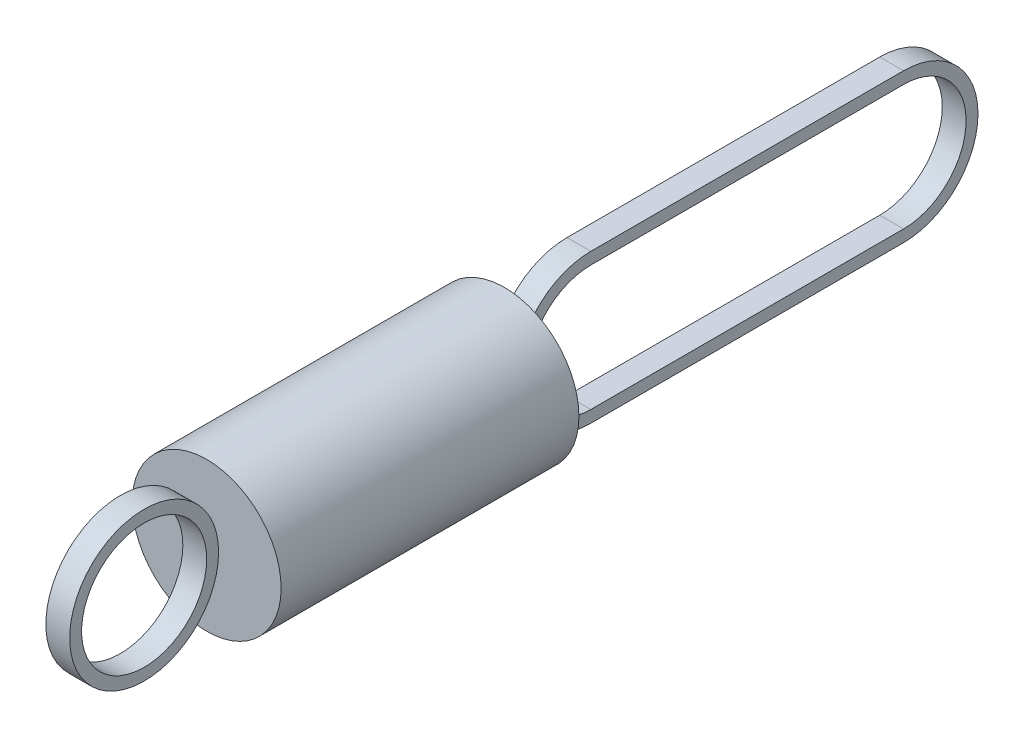
ISO-10303-21;
HEADER;
FILE_DESCRIPTION(('STEP AP214'),'2;1');
FILE_NAME('part.step','',(''),(''),'','','');
FILE_SCHEMA(('AUTOMOTIVE_DESIGN { 1 0 10303 214 1 1 1 1 }'));
ENDSEC;
DATA;
#1=APPLICATION_CONTEXT('core data for automotive mechanical design processes');
#2=APPLICATION_PROTOCOL_DEFINITION('international standard','automotive_design',2000,#1);
#3=PRODUCT_CONTEXT('',#1,'mechanical');
#4=PRODUCT('Part','Part','',(#3));
#5=PRODUCT_RELATED_PRODUCT_CATEGORY('part','',(#4));
#6=PRODUCT_DEFINITION_FORMATION('','',#4);
#7=PRODUCT_DEFINITION_CONTEXT('part definition',#1,'design');
#8=PRODUCT_DEFINITION('design','',#6,#7);
#9=PRODUCT_DEFINITION_SHAPE('','',#8);
#10=(LENGTH_UNIT() NAMED_UNIT(*) SI_UNIT(.MILLI.,.METRE.));
#11=(NAMED_UNIT(*) PLANE_ANGLE_UNIT() SI_UNIT($,.RADIAN.));
#12=(NAMED_UNIT(*) SI_UNIT($,.STERADIAN.) SOLID_ANGLE_UNIT());
#13=UNCERTAINTY_MEASURE_WITH_UNIT(LENGTH_MEASURE(1.E-05),#10,'distance_accuracy_value','');
#14=(GEOMETRIC_REPRESENTATION_CONTEXT(3) GLOBAL_UNCERTAINTY_ASSIGNED_CONTEXT((#13)) GLOBAL_UNIT_ASSIGNED_CONTEXT((#10,
#11,#12)) REPRESENTATION_CONTEXT('',''));
#15=CARTESIAN_POINT('',(0.,0.,0.));
#16=DIRECTION('',(0.,0.,1.));
#17=DIRECTION('',(1.,0.,0.));
#18=AXIS2_PLACEMENT_3D('',#15,#16,#17);
#19=CARTESIAN_POINT('',(0.,0.,-25.));
#20=DIRECTION('',(0.,0.,1.));
#21=DIRECTION('',(1.,0.,0.));
#22=AXIS2_PLACEMENT_3D('',#19,#20,#21);
#23=CYLINDRICAL_SURFACE('',#22,5.);
#24=CARTESIAN_POINT('',(0.,0.,-25.));
#25=DIRECTION('',(0.,0.,1.));
#26=DIRECTION('',(1.,0.,0.));
#27=AXIS2_PLACEMENT_3D('',#24,#25,#26);
#28=CIRCLE('',#27,5.);
#29=CARTESIAN_POINT('',(5.,0.,-25.));
#30=VERTEX_POINT('',#29);
#31=EDGE_CURVE('E11',#30,#30,#28,.T.);
#32=ORIENTED_EDGE('',*,*,#31,.T.);
#33=EDGE_LOOP('',(#32));
#34=FACE_BOUND('',#33,.T.);
#35=CARTESIAN_POINT('',(0.,0.,-5.));
#36=DIRECTION('',(0.,0.,1.));
#37=DIRECTION('',(1.,0.,0.));
#38=AXIS2_PLACEMENT_3D('',#35,#36,#37);
#39=CIRCLE('',#38,5.);
#40=CARTESIAN_POINT('',(5.,0.,-5.));
#41=VERTEX_POINT('',#40);
#42=EDGE_CURVE('E47',#41,#41,#39,.T.);
#43=ORIENTED_EDGE('',*,*,#42,.F.);
#44=EDGE_LOOP('',(#43));
#45=FACE_BOUND('',#44,.T.);
#46=ADVANCED_FACE('F44',(#34,#45),#23,.T.);
#47=CARTESIAN_POINT('',(0.,0.,-25.));
#48=DIRECTION('',(0.,0.,1.));
#49=DIRECTION('',(1.,0.,0.));
#50=AXIS2_PLACEMENT_3D('',#47,#48,#49);
#51=PLANE('',#50);
#52=ORIENTED_EDGE('',*,*,#31,.F.);
#53=EDGE_LOOP('',(#52));
#54=FACE_BOUND('',#53,.T.);
#55=ADVANCED_FACE('F59',(#54),#51,.F.);
#56=CARTESIAN_POINT('',(0.,0.,-5.));
#57=DIRECTION('',(0.,0.,1.));
#58=DIRECTION('',(1.,0.,0.));
#59=AXIS2_PLACEMENT_3D('',#56,#57,#58);
#60=PLANE('',#59);
#61=ORIENTED_EDGE('',*,*,#42,.T.);
#62=EDGE_LOOP('',(#61));
#63=FACE_BOUND('',#62,.T.);
#64=ADVANCED_FACE('F56',(#63),#60,.T.);
#65=CLOSED_SHELL('',(#46,#55,#64));
#66=MANIFOLD_SOLID_BREP('B2',#65);
#67=CARTESIAN_POINT('',(-0.8,0.,-51.));
#68=DIRECTION('',(1.,0.,0.));
#69=DIRECTION('',(0.,0.,-1.));
#70=AXIS2_PLACEMENT_3D('',#67,#68,#69);
#71=CYLINDRICAL_SURFACE('',#70,5.);
#72=DIRECTION('',(1.,0.,0.));
#73=VECTOR('',#72,1.);
#74=CARTESIAN_POINT('',(-0.8,5.,-51.));
#75=LINE('',#74,#73);
#76=CARTESIAN_POINT('',(-0.8,5.,-51.));
#77=VERTEX_POINT('',#76);
#78=CARTESIAN_POINT('',(0.8,5.,-51.));
#79=VERTEX_POINT('',#78);
#80=EDGE_CURVE('E95',#77,#79,#75,.T.);
#81=ORIENTED_EDGE('',*,*,#80,.T.);
#82=CARTESIAN_POINT('',(0.8,0.,-51.));
#83=DIRECTION('',(1.,0.,0.));
#84=DIRECTION('',(0.,0.,-1.));
#85=AXIS2_PLACEMENT_3D('',#82,#83,#84);
#86=CIRCLE('',#85,5.);
#87=CARTESIAN_POINT('',(0.8,-5.,-51.));
#88=VERTEX_POINT('',#87);
#89=EDGE_CURVE('E171',#88,#79,#86,.T.);
#90=ORIENTED_EDGE('',*,*,#89,.F.);
#91=DIRECTION('',(1.,0.,0.));
#92=VECTOR('',#91,1.);
#93=CARTESIAN_POINT('',(-0.8,-5.,-51.));
#94=LINE('',#93,#92);
#95=CARTESIAN_POINT('',(-0.8,-5.,-51.));
#96=VERTEX_POINT('',#95);
#97=EDGE_CURVE('E42',#96,#88,#94,.T.);
#98=ORIENTED_EDGE('',*,*,#97,.F.);
#99=CARTESIAN_POINT('',(-0.8,0.,-51.));
#100=DIRECTION('',(1.,0.,0.));
#101=DIRECTION('',(0.,0.,-1.));
#102=AXIS2_PLACEMENT_3D('',#99,#100,#101);
#103=CIRCLE('',#102,5.);
#104=EDGE_CURVE('E205',#96,#77,#103,.T.);
#105=ORIENTED_EDGE('',*,*,#104,.T.);
#106=EDGE_LOOP('',(#81,#90,#98,#105));
#107=FACE_BOUND('',#106,.T.);
#108=ADVANCED_FACE('F92',(#107),#71,.T.);
#109=CARTESIAN_POINT('',(-0.8,-5.,-51.));
#110=DIRECTION('',(0.,-1.,0.));
#111=DIRECTION('',(0.,0.,-1.));
#112=AXIS2_PLACEMENT_3D('',#109,#110,#111);
#113=PLANE('',#112);
#114=ORIENTED_EDGE('',*,*,#97,.T.);
#115=DIRECTION('',(0.,0.,-1.));
#116=VECTOR('',#115,1.);
#117=CARTESIAN_POINT('',(0.8,-5.,-51.));
#118=LINE('',#117,#116);
#119=CARTESIAN_POINT('',(0.8,-5.,-30.));
#120=VERTEX_POINT('',#119);
#121=EDGE_CURVE('E202',#120,#88,#118,.T.);
#122=ORIENTED_EDGE('',*,*,#121,.F.);
#123=DIRECTION('',(1.,0.,0.));
#124=VECTOR('',#123,1.);
#125=CARTESIAN_POINT('',(-0.8,-5.,-30.));
#126=LINE('',#125,#124);
#127=CARTESIAN_POINT('',(-0.8,-5.,-30.));
#128=VERTEX_POINT('',#127);
#129=EDGE_CURVE('E100',#128,#120,#126,.T.);
#130=ORIENTED_EDGE('',*,*,#129,.F.);
#131=DIRECTION('',(0.,0.,-1.));
#132=VECTOR('',#131,1.);
#133=CARTESIAN_POINT('',(-0.8,-5.,-51.));
#134=LINE('',#133,#132);
#135=EDGE_CURVE('E214',#128,#96,#134,.T.);
#136=ORIENTED_EDGE('',*,*,#135,.T.);
#137=EDGE_LOOP('',(#114,#122,#130,#136));
#138=FACE_BOUND('',#137,.T.);
#139=ADVANCED_FACE('F230',(#138),#113,.T.);
#140=CARTESIAN_POINT('',(-0.8,0.,-30.));
#141=DIRECTION('',(1.,0.,0.));
#142=DIRECTION('',(0.,0.,-1.));
#143=AXIS2_PLACEMENT_3D('',#140,#141,#142);
#144=CYLINDRICAL_SURFACE('',#143,5.);
#145=ORIENTED_EDGE('',*,*,#129,.T.);
#146=CARTESIAN_POINT('',(0.8,0.,-30.));
#147=DIRECTION('',(1.,0.,0.));
#148=DIRECTION('',(0.,0.,-1.));
#149=AXIS2_PLACEMENT_3D('',#146,#147,#148);
#150=CIRCLE('',#149,5.);
#151=CARTESIAN_POINT('',(0.8,5.,-30.));
#152=VERTEX_POINT('',#151);
#153=EDGE_CURVE('E199',#152,#120,#150,.T.);
#154=ORIENTED_EDGE('',*,*,#153,.F.);
#155=DIRECTION('',(1.,0.,0.));
#156=VECTOR('',#155,1.);
#157=CARTESIAN_POINT('',(-0.8,5.,-30.));
#158=LINE('',#157,#156);
#159=CARTESIAN_POINT('',(-0.8,5.,-30.));
#160=VERTEX_POINT('',#159);
#161=EDGE_CURVE('E217',#160,#152,#158,.T.);
#162=ORIENTED_EDGE('',*,*,#161,.F.);
#163=CARTESIAN_POINT('',(-0.8,0.,-30.));
#164=DIRECTION('',(1.,0.,0.));
#165=DIRECTION('',(0.,0.,-1.));
#166=AXIS2_PLACEMENT_3D('',#163,#164,#165);
#167=CIRCLE('',#166,5.);
#168=EDGE_CURVE('E211',#160,#128,#167,.T.);
#169=ORIENTED_EDGE('',*,*,#168,.T.);
#170=EDGE_LOOP('',(#145,#154,#162,#169));
#171=FACE_BOUND('',#170,.T.);
#172=ADVANCED_FACE('F234',(#171),#144,.T.);
#173=CARTESIAN_POINT('',(-0.8,5.,-51.));
#174=DIRECTION('',(0.,1.,0.));
#175=DIRECTION('',(0.,0.,1.));
#176=AXIS2_PLACEMENT_3D('',#173,#174,#175);
#177=PLANE('',#176);
#178=ORIENTED_EDGE('',*,*,#161,.T.);
#179=DIRECTION('',(0.,0.,1.));
#180=VECTOR('',#179,1.);
#181=CARTESIAN_POINT('',(0.8,5.,-51.));
#182=LINE('',#181,#180);
#183=EDGE_CURVE('E196',#79,#152,#182,.T.);
#184=ORIENTED_EDGE('',*,*,#183,.F.);
#185=ORIENTED_EDGE('',*,*,#80,.F.);
#186=DIRECTION('',(0.,0.,1.));
#187=VECTOR('',#186,1.);
#188=CARTESIAN_POINT('',(-0.8,5.,-51.));
#189=LINE('',#188,#187);
#190=EDGE_CURVE('E208',#77,#160,#189,.T.);
#191=ORIENTED_EDGE('',*,*,#190,.T.);
#192=EDGE_LOOP('',(#178,#184,#185,#191));
#193=FACE_BOUND('',#192,.T.);
#194=ADVANCED_FACE('F224',(#193),#177,.T.);
#195=CARTESIAN_POINT('',(-0.8,0.,-51.));
#196=DIRECTION('',(1.,0.,0.));
#197=DIRECTION('',(0.,0.,-1.));
#198=AXIS2_PLACEMENT_3D('',#195,#196,#197);
#199=PLANE('',#198);
#200=DIRECTION('',(0.,0.,1.));
#201=VECTOR('',#200,1.);
#202=CARTESIAN_POINT('',(-0.8,-4.2,-51.));
#203=LINE('',#202,#201);
#204=CARTESIAN_POINT('',(-0.8,-4.2,-51.));
#205=VERTEX_POINT('',#204);
#206=CARTESIAN_POINT('',(-0.8,-4.2,-30.));
#207=VERTEX_POINT('',#206);
#208=EDGE_CURVE('E177',#205,#207,#203,.T.);
#209=ORIENTED_EDGE('',*,*,#208,.F.);
#210=CARTESIAN_POINT('',(-0.8,0.,-51.));
#211=DIRECTION('',(1.,0.,0.));
#212=DIRECTION('',(0.,0.,-1.));
#213=AXIS2_PLACEMENT_3D('',#210,#211,#212);
#214=CIRCLE('',#213,4.2);
#215=CARTESIAN_POINT('',(-0.8,4.2,-51.));
#216=VERTEX_POINT('',#215);
#217=EDGE_CURVE('E159',#216,#205,#214,.F.);
#218=ORIENTED_EDGE('',*,*,#217,.F.);
#219=DIRECTION('',(0.,0.,-1.));
#220=VECTOR('',#219,1.);
#221=CARTESIAN_POINT('',(-0.8,4.2,-51.));
#222=LINE('',#221,#220);
#223=CARTESIAN_POINT('',(-0.8,4.2,-30.));
#224=VERTEX_POINT('',#223);
#225=EDGE_CURVE('E168',#224,#216,#222,.T.);
#226=ORIENTED_EDGE('',*,*,#225,.F.);
#227=CARTESIAN_POINT('',(-0.8,0.,-30.));
#228=DIRECTION('',(1.,0.,0.));
#229=DIRECTION('',(0.,0.,-1.));
#230=AXIS2_PLACEMENT_3D('',#227,#228,#229);
#231=CIRCLE('',#230,4.2);
#232=EDGE_CURVE('E108',#207,#224,#231,.F.);
#233=ORIENTED_EDGE('',*,*,#232,.F.);
#234=EDGE_LOOP('',(#209,#218,#226,#233));
#235=FACE_BOUND('',#234,.T.);
#236=ORIENTED_EDGE('',*,*,#104,.F.);
#237=ORIENTED_EDGE('',*,*,#135,.F.);
#238=ORIENTED_EDGE('',*,*,#168,.F.);
#239=ORIENTED_EDGE('',*,*,#190,.F.);
#240=EDGE_LOOP('',(#236,#237,#238,#239));
#241=FACE_BOUND('',#240,.T.);
#242=ADVANCED_FACE('F174',(#235,#241),#199,.F.);
#243=CARTESIAN_POINT('',(0.8,0.,-51.));
#244=DIRECTION('',(1.,0.,0.));
#245=DIRECTION('',(0.,0.,-1.));
#246=AXIS2_PLACEMENT_3D('',#243,#244,#245);
#247=PLANE('',#246);
#248=CARTESIAN_POINT('',(0.8,0.,-51.));
#249=DIRECTION('',(1.,0.,0.));
#250=DIRECTION('',(0.,0.,-1.));
#251=AXIS2_PLACEMENT_3D('',#248,#249,#250);
#252=CIRCLE('',#251,4.2);
#253=CARTESIAN_POINT('',(0.8,-4.2,-51.));
#254=VERTEX_POINT('',#253);
#255=CARTESIAN_POINT('',(0.8,4.2,-51.));
#256=VERTEX_POINT('',#255);
#257=EDGE_CURVE('E116',#254,#256,#252,.T.);
#258=ORIENTED_EDGE('',*,*,#257,.F.);
#259=DIRECTION('',(0.,0.,-1.));
#260=VECTOR('',#259,1.);
#261=CARTESIAN_POINT('',(0.8,-4.2,-51.));
#262=LINE('',#261,#260);
#263=CARTESIAN_POINT('',(0.8,-4.2,-30.));
#264=VERTEX_POINT('',#263);
#265=EDGE_CURVE('E165',#264,#254,#262,.T.);
#266=ORIENTED_EDGE('',*,*,#265,.F.);
#267=CARTESIAN_POINT('',(0.8,0.,-30.));
#268=DIRECTION('',(1.,0.,0.));
#269=DIRECTION('',(0.,0.,-1.));
#270=AXIS2_PLACEMENT_3D('',#267,#268,#269);
#271=CIRCLE('',#270,4.2);
#272=CARTESIAN_POINT('',(0.8,4.2,-30.));
#273=VERTEX_POINT('',#272);
#274=EDGE_CURVE('E185',#273,#264,#271,.T.);
#275=ORIENTED_EDGE('',*,*,#274,.F.);
#276=DIRECTION('',(0.,0.,1.));
#277=VECTOR('',#276,1.);
#278=CARTESIAN_POINT('',(0.8,4.2,-51.));
#279=LINE('',#278,#277);
#280=EDGE_CURVE('E179',#256,#273,#279,.T.);
#281=ORIENTED_EDGE('',*,*,#280,.F.);
#282=EDGE_LOOP('',(#258,#266,#275,#281));
#283=FACE_BOUND('',#282,.T.);
#284=ORIENTED_EDGE('',*,*,#89,.T.);
#285=ORIENTED_EDGE('',*,*,#183,.T.);
#286=ORIENTED_EDGE('',*,*,#153,.T.);
#287=ORIENTED_EDGE('',*,*,#121,.T.);
#288=EDGE_LOOP('',(#284,#285,#286,#287));
#289=FACE_BOUND('',#288,.T.);
#290=ADVANCED_FACE('F227',(#283,#289),#247,.T.);
#291=CARTESIAN_POINT('',(-0.801,0.,-51.));
#292=DIRECTION('',(1.,0.,0.));
#293=DIRECTION('',(0.,0.,-1.));
#294=AXIS2_PLACEMENT_3D('',#291,#292,#293);
#295=CYLINDRICAL_SURFACE('',#294,4.2);
#296=ORIENTED_EDGE('',*,*,#217,.T.);
#297=DIRECTION('',(1.,0.,0.));
#298=VECTOR('',#297,1.);
#299=CARTESIAN_POINT('',(-0.801,-4.2,-51.));
#300=LINE('',#299,#298);
#301=EDGE_CURVE('E172',#205,#254,#300,.T.);
#302=ORIENTED_EDGE('',*,*,#301,.T.);
#303=ORIENTED_EDGE('',*,*,#257,.T.);
#304=DIRECTION('',(1.,0.,0.));
#305=VECTOR('',#304,1.);
#306=CARTESIAN_POINT('',(-0.801,4.2,-51.));
#307=LINE('',#306,#305);
#308=EDGE_CURVE('E155',#216,#256,#307,.T.);
#309=ORIENTED_EDGE('',*,*,#308,.F.);
#310=EDGE_LOOP('',(#296,#302,#303,#309));
#311=FACE_BOUND('',#310,.T.);
#312=ADVANCED_FACE('F157',(#311),#295,.F.);
#313=CARTESIAN_POINT('',(-0.801,-4.2,-51.));
#314=DIRECTION('',(0.,-1.,0.));
#315=DIRECTION('',(0.,0.,-1.));
#316=AXIS2_PLACEMENT_3D('',#313,#314,#315);
#317=PLANE('',#316);
#318=ORIENTED_EDGE('',*,*,#208,.T.);
#319=DIRECTION('',(1.,0.,0.));
#320=VECTOR('',#319,1.);
#321=CARTESIAN_POINT('',(-0.801,-4.2,-30.));
#322=LINE('',#321,#320);
#323=EDGE_CURVE('E191',#207,#264,#322,.T.);
#324=ORIENTED_EDGE('',*,*,#323,.T.);
#325=ORIENTED_EDGE('',*,*,#265,.T.);
#326=ORIENTED_EDGE('',*,*,#301,.F.);
#327=EDGE_LOOP('',(#318,#324,#325,#326));
#328=FACE_BOUND('',#327,.T.);
#329=ADVANCED_FACE('F285',(#328),#317,.F.);
#330=CARTESIAN_POINT('',(-0.801,0.,-30.));
#331=DIRECTION('',(1.,0.,0.));
#332=DIRECTION('',(0.,0.,-1.));
#333=AXIS2_PLACEMENT_3D('',#330,#331,#332);
#334=CYLINDRICAL_SURFACE('',#333,4.2);
#335=ORIENTED_EDGE('',*,*,#232,.T.);
#336=DIRECTION('',(1.,0.,0.));
#337=VECTOR('',#336,1.);
#338=CARTESIAN_POINT('',(-0.801,4.2,-30.));
#339=LINE('',#338,#337);
#340=EDGE_CURVE('E164',#224,#273,#339,.T.);
#341=ORIENTED_EDGE('',*,*,#340,.T.);
#342=ORIENTED_EDGE('',*,*,#274,.T.);
#343=ORIENTED_EDGE('',*,*,#323,.F.);
#344=EDGE_LOOP('',(#335,#341,#342,#343));
#345=FACE_BOUND('',#344,.T.);
#346=ADVANCED_FACE('F294',(#345),#334,.F.);
#347=CARTESIAN_POINT('',(-0.801,4.2,-51.));
#348=DIRECTION('',(0.,1.,0.));
#349=DIRECTION('',(0.,0.,1.));
#350=AXIS2_PLACEMENT_3D('',#347,#348,#349);
#351=PLANE('',#350);
#352=ORIENTED_EDGE('',*,*,#225,.T.);
#353=ORIENTED_EDGE('',*,*,#308,.T.);
#354=ORIENTED_EDGE('',*,*,#280,.T.);
#355=ORIENTED_EDGE('',*,*,#340,.F.);
#356=EDGE_LOOP('',(#352,#353,#354,#355));
#357=FACE_BOUND('',#356,.T.);
#358=ADVANCED_FACE('F169',(#357),#351,.F.);
#359=CLOSED_SHELL('',(#108,#139,#172,#194,#242,#290,#312,#329,#346,#358));
#360=MANIFOLD_SOLID_BREP('B6',#359);
#361=CARTESIAN_POINT('',(-0.8,0.,0.));
#362=DIRECTION('',(1.,0.,0.));
#363=DIRECTION('',(0.,0.,-1.));
#364=AXIS2_PLACEMENT_3D('',#361,#362,#363);
#365=CYLINDRICAL_SURFACE('',#364,5.);
#366=CARTESIAN_POINT('',(-0.8,0.,0.));
#367=DIRECTION('',(1.,0.,0.));
#368=DIRECTION('',(0.,0.,-1.));
#369=AXIS2_PLACEMENT_3D('',#366,#367,#368);
#370=CIRCLE('',#369,5.);
#371=CARTESIAN_POINT('',(-0.8,0.,-5.));
#372=VERTEX_POINT('',#371);
#373=EDGE_CURVE('E91',#372,#372,#370,.T.);
#374=ORIENTED_EDGE('',*,*,#373,.T.);
#375=EDGE_LOOP('',(#374));
#376=FACE_BOUND('',#375,.T.);
#377=CARTESIAN_POINT('',(0.8,0.,0.));
#378=DIRECTION('',(1.,0.,0.));
#379=DIRECTION('',(0.,0.,-1.));
#380=AXIS2_PLACEMENT_3D('',#377,#378,#379);
#381=CIRCLE('',#380,5.);
#382=CARTESIAN_POINT('',(0.8,0.,-5.));
#383=VERTEX_POINT('',#382);
#384=EDGE_CURVE('E328',#383,#383,#381,.T.);
#385=ORIENTED_EDGE('',*,*,#384,.F.);
#386=EDGE_LOOP('',(#385));
#387=FACE_BOUND('',#386,.T.);
#388=ADVANCED_FACE('F322',(#376,#387),#365,.T.);
#389=CARTESIAN_POINT('',(-0.8,0.,0.));
#390=DIRECTION('',(1.,0.,0.));
#391=DIRECTION('',(0.,0.,-1.));
#392=AXIS2_PLACEMENT_3D('',#389,#390,#391);
#393=PLANE('',#392);
#394=CARTESIAN_POINT('',(-0.8,0.,0.));
#395=DIRECTION('',(1.,0.,0.));
#396=DIRECTION('',(0.,0.,-1.));
#397=AXIS2_PLACEMENT_3D('',#394,#395,#396);
#398=CIRCLE('',#397,4.2);
#399=CARTESIAN_POINT('',(-0.8,0.,-4.2));
#400=VERTEX_POINT('',#399);
#401=EDGE_CURVE('E332',#400,#400,#398,.F.);
#402=ORIENTED_EDGE('',*,*,#401,.F.);
#403=EDGE_LOOP('',(#402));
#404=FACE_BOUND('',#403,.T.);
#405=ORIENTED_EDGE('',*,*,#373,.F.);
#406=EDGE_LOOP('',(#405));
#407=FACE_BOUND('',#406,.T.);
#408=ADVANCED_FACE('F347',(#404,#407),#393,.F.);
#409=CARTESIAN_POINT('',(0.8,0.,0.));
#410=DIRECTION('',(1.,0.,0.));
#411=DIRECTION('',(0.,0.,-1.));
#412=AXIS2_PLACEMENT_3D('',#409,#410,#411);
#413=PLANE('',#412);
#414=CARTESIAN_POINT('',(0.8,0.,0.));
#415=DIRECTION('',(1.,0.,0.));
#416=DIRECTION('',(0.,0.,-1.));
#417=AXIS2_PLACEMENT_3D('',#414,#415,#416);
#418=CIRCLE('',#417,4.2);
#419=CARTESIAN_POINT('',(0.8,0.,-4.2));
#420=VERTEX_POINT('',#419);
#421=EDGE_CURVE('E336',#420,#420,#418,.T.);
#422=ORIENTED_EDGE('',*,*,#421,.F.);
#423=EDGE_LOOP('',(#422));
#424=FACE_BOUND('',#423,.T.);
#425=ORIENTED_EDGE('',*,*,#384,.T.);
#426=EDGE_LOOP('',(#425));
#427=FACE_BOUND('',#426,.T.);
#428=ADVANCED_FACE('F345',(#424,#427),#413,.T.);
#429=CARTESIAN_POINT('',(-0.801,0.,0.));
#430=DIRECTION('',(1.,0.,0.));
#431=DIRECTION('',(0.,0.,-1.));
#432=AXIS2_PLACEMENT_3D('',#429,#430,#431);
#433=CYLINDRICAL_SURFACE('',#432,4.2);
#434=ORIENTED_EDGE('',*,*,#421,.T.);
#435=EDGE_LOOP('',(#434));
#436=FACE_BOUND('',#435,.T.);
#437=ORIENTED_EDGE('',*,*,#401,.T.);
#438=EDGE_LOOP('',(#437));
#439=FACE_BOUND('',#438,.T.);
#440=ADVANCED_FACE('F342',(#436,#439),#433,.F.);
#441=CLOSED_SHELL('',(#388,#408,#428,#440));
#442=MANIFOLD_SOLID_BREP('B36',#441);
#443=ADVANCED_BREP_SHAPE_REPRESENTATION('',(#18,#66,#360,#442),#14);
#444=SHAPE_DEFINITION_REPRESENTATION(#9,#443);
ENDSEC;
END-ISO-10303-21;
